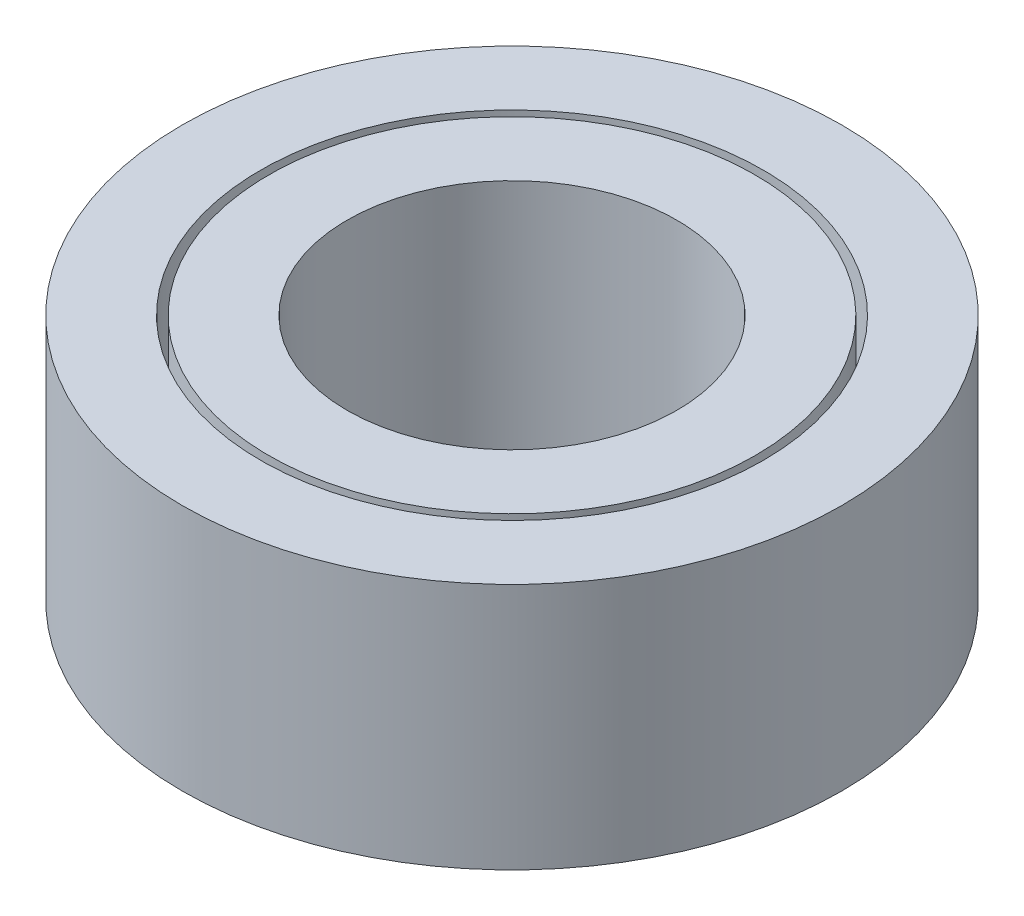
ISO-10303-21;
HEADER;
FILE_DESCRIPTION(('STEP AP214'),'2;1');
FILE_NAME('part.step','',(''),(''),'','','');
FILE_SCHEMA(('AUTOMOTIVE_DESIGN { 1 0 10303 214 1 1 1 1 }'));
ENDSEC;
DATA;
#1=APPLICATION_CONTEXT('core data for automotive mechanical design processes');
#2=APPLICATION_PROTOCOL_DEFINITION('international standard','automotive_design',2000,#1);
#3=PRODUCT_CONTEXT('',#1,'mechanical');
#4=PRODUCT('Part','Part','',(#3));
#5=PRODUCT_RELATED_PRODUCT_CATEGORY('part','',(#4));
#6=PRODUCT_DEFINITION_FORMATION('','',#4);
#7=PRODUCT_DEFINITION_CONTEXT('part definition',#1,'design');
#8=PRODUCT_DEFINITION('design','',#6,#7);
#9=PRODUCT_DEFINITION_SHAPE('','',#8);
#10=(LENGTH_UNIT() NAMED_UNIT(*) SI_UNIT(.MILLI.,.METRE.));
#11=(NAMED_UNIT(*) PLANE_ANGLE_UNIT() SI_UNIT($,.RADIAN.));
#12=(NAMED_UNIT(*) SI_UNIT($,.STERADIAN.) SOLID_ANGLE_UNIT());
#13=UNCERTAINTY_MEASURE_WITH_UNIT(LENGTH_MEASURE(1.E-05),#10,'distance_accuracy_value','');
#14=(GEOMETRIC_REPRESENTATION_CONTEXT(3) GLOBAL_UNCERTAINTY_ASSIGNED_CONTEXT((#13)) GLOBAL_UNIT_ASSIGNED_CONTEXT((#10,
#11,#12)) REPRESENTATION_CONTEXT('',''));
#15=CARTESIAN_POINT('',(0.,0.,0.));
#16=DIRECTION('',(0.,0.,1.));
#17=DIRECTION('',(1.,0.,0.));
#18=AXIS2_PLACEMENT_3D('',#15,#16,#17);
#19=CARTESIAN_POINT('',(0.,3.,0.));
#20=DIRECTION('',(0.,-1.,0.));
#21=DIRECTION('',(0.,0.,-1.));
#22=AXIS2_PLACEMENT_3D('',#19,#20,#21);
#23=CYLINDRICAL_SURFACE('',#22,4.);
#24=CARTESIAN_POINT('',(0.,3.,0.));
#25=DIRECTION('',(0.,1.,0.));
#26=DIRECTION('',(0.,0.,1.));
#27=AXIS2_PLACEMENT_3D('',#24,#25,#26);
#28=CIRCLE('',#27,4.);
#29=CARTESIAN_POINT('',(0.,3.,4.));
#30=VERTEX_POINT('',#29);
#31=EDGE_CURVE('E72',#30,#30,#28,.T.);
#32=ORIENTED_EDGE('',*,*,#31,.F.);
#33=EDGE_LOOP('',(#32));
#34=FACE_BOUND('',#33,.T.);
#35=CARTESIAN_POINT('',(0.,0.,0.));
#36=DIRECTION('',(0.,1.,0.));
#37=DIRECTION('',(0.,0.,1.));
#38=AXIS2_PLACEMENT_3D('',#35,#36,#37);
#39=CIRCLE('',#38,4.);
#40=CARTESIAN_POINT('',(0.,0.,4.));
#41=VERTEX_POINT('',#40);
#42=EDGE_CURVE('E77',#41,#41,#39,.T.);
#43=ORIENTED_EDGE('',*,*,#42,.T.);
#44=EDGE_LOOP('',(#43));
#45=FACE_BOUND('',#44,.T.);
#46=ADVANCED_FACE('F59',(#34,#45),#23,.T.);
#47=CARTESIAN_POINT('',(0.,3.,0.));
#48=DIRECTION('',(0.,1.,0.));
#49=DIRECTION('',(0.,0.,1.));
#50=AXIS2_PLACEMENT_3D('',#47,#48,#49);
#51=PLANE('',#50);
#52=CARTESIAN_POINT('',(0.,3.,0.));
#53=DIRECTION('',(0.,1.,0.));
#54=DIRECTION('',(1.,0.,0.));
#55=AXIS2_PLACEMENT_3D('',#52,#53,#54);
#56=CIRCLE('',#55,3.05);
#57=CARTESIAN_POINT('',(3.05,3.,0.));
#58=VERTEX_POINT('',#57);
#59=EDGE_CURVE('E12',#58,#58,#56,.T.);
#60=ORIENTED_EDGE('',*,*,#59,.F.);
#61=EDGE_LOOP('',(#60));
#62=FACE_BOUND('',#61,.T.);
#63=ORIENTED_EDGE('',*,*,#31,.T.);
#64=EDGE_LOOP('',(#63));
#65=FACE_BOUND('',#64,.T.);
#66=ADVANCED_FACE('F87',(#62,#65),#51,.T.);
#67=CARTESIAN_POINT('',(0.,0.,0.));
#68=DIRECTION('',(0.,1.,0.));
#69=DIRECTION('',(0.,0.,1.));
#70=AXIS2_PLACEMENT_3D('',#67,#68,#69);
#71=PLANE('',#70);
#72=CARTESIAN_POINT('',(0.,0.,0.));
#73=DIRECTION('',(0.,1.,0.));
#74=DIRECTION('',(1.,0.,0.));
#75=AXIS2_PLACEMENT_3D('',#72,#73,#74);
#76=CIRCLE('',#75,3.05);
#77=CARTESIAN_POINT('',(3.05,0.,0.));
#78=VERTEX_POINT('',#77);
#79=EDGE_CURVE('E67',#78,#78,#76,.T.);
#80=ORIENTED_EDGE('',*,*,#79,.T.);
#81=EDGE_LOOP('',(#80));
#82=FACE_BOUND('',#81,.T.);
#83=ORIENTED_EDGE('',*,*,#42,.F.);
#84=EDGE_LOOP('',(#83));
#85=FACE_BOUND('',#84,.T.);
#86=ADVANCED_FACE('F61',(#82,#85),#71,.F.);
#87=CARTESIAN_POINT('',(0.,3.,0.));
#88=DIRECTION('',(0.,-1.,0.));
#89=DIRECTION('',(0.,0.,-1.));
#90=AXIS2_PLACEMENT_3D('',#87,#88,#89);
#91=CYLINDRICAL_SURFACE('',#90,3.05);
#92=ORIENTED_EDGE('',*,*,#59,.T.);
#93=EDGE_LOOP('',(#92));
#94=FACE_BOUND('',#93,.T.);
#95=ORIENTED_EDGE('',*,*,#79,.F.);
#96=EDGE_LOOP('',(#95));
#97=FACE_BOUND('',#96,.T.);
#98=ADVANCED_FACE('F86',(#94,#97),#91,.F.);
#99=CLOSED_SHELL('',(#46,#66,#86,#98));
#100=MANIFOLD_SOLID_BREP('B2',#99);
#101=CARTESIAN_POINT('',(0.,3.,0.));
#102=DIRECTION('',(0.,1.,0.));
#103=DIRECTION('',(0.,0.,1.));
#104=AXIS2_PLACEMENT_3D('',#101,#102,#103);
#105=PLANE('',#104);
#106=CARTESIAN_POINT('',(0.,3.,0.));
#107=DIRECTION('',(0.,1.,0.));
#108=DIRECTION('',(0.,0.,1.));
#109=AXIS2_PLACEMENT_3D('',#106,#107,#108);
#110=CIRCLE('',#109,2.);
#111=CARTESIAN_POINT('',(0.,3.,2.));
#112=VERTEX_POINT('',#111);
#113=EDGE_CURVE('E58',#112,#112,#110,.T.);
#114=ORIENTED_EDGE('',*,*,#113,.F.);
#115=EDGE_LOOP('',(#114));
#116=FACE_BOUND('',#115,.T.);
#117=CARTESIAN_POINT('',(0.,3.,0.));
#118=DIRECTION('',(0.,1.,0.));
#119=DIRECTION('',(1.,0.,0.));
#120=AXIS2_PLACEMENT_3D('',#117,#118,#119);
#121=CIRCLE('',#120,2.95);
#122=CARTESIAN_POINT('',(2.95,3.,0.));
#123=VERTEX_POINT('',#122);
#124=EDGE_CURVE('E142',#123,#123,#121,.T.);
#125=ORIENTED_EDGE('',*,*,#124,.T.);
#126=EDGE_LOOP('',(#125));
#127=FACE_BOUND('',#126,.T.);
#128=ADVANCED_FACE('F131',(#116,#127),#105,.T.);
#129=CARTESIAN_POINT('',(0.,3.,0.));
#130=DIRECTION('',(0.,-1.,0.));
#131=DIRECTION('',(0.,0.,-1.));
#132=AXIS2_PLACEMENT_3D('',#129,#130,#131);
#133=CYLINDRICAL_SURFACE('',#132,2.);
#134=ORIENTED_EDGE('',*,*,#113,.T.);
#135=EDGE_LOOP('',(#134));
#136=FACE_BOUND('',#135,.T.);
#137=CARTESIAN_POINT('',(0.,0.,0.));
#138=DIRECTION('',(0.,1.,0.));
#139=DIRECTION('',(0.,0.,1.));
#140=AXIS2_PLACEMENT_3D('',#137,#138,#139);
#141=CIRCLE('',#140,2.);
#142=CARTESIAN_POINT('',(0.,0.,2.));
#143=VERTEX_POINT('',#142);
#144=EDGE_CURVE('E135',#143,#143,#141,.T.);
#145=ORIENTED_EDGE('',*,*,#144,.F.);
#146=EDGE_LOOP('',(#145));
#147=FACE_BOUND('',#146,.T.);
#148=ADVANCED_FACE('F158',(#136,#147),#133,.F.);
#149=CARTESIAN_POINT('',(0.,0.,0.));
#150=DIRECTION('',(0.,1.,0.));
#151=DIRECTION('',(0.,0.,1.));
#152=AXIS2_PLACEMENT_3D('',#149,#150,#151);
#153=PLANE('',#152);
#154=ORIENTED_EDGE('',*,*,#144,.T.);
#155=EDGE_LOOP('',(#154));
#156=FACE_BOUND('',#155,.T.);
#157=CARTESIAN_POINT('',(0.,0.,0.));
#158=DIRECTION('',(0.,1.,0.));
#159=DIRECTION('',(1.,0.,0.));
#160=AXIS2_PLACEMENT_3D('',#157,#158,#159);
#161=CIRCLE('',#160,2.95);
#162=CARTESIAN_POINT('',(2.95,0.,0.));
#163=VERTEX_POINT('',#162);
#164=EDGE_CURVE('E144',#163,#163,#161,.T.);
#165=ORIENTED_EDGE('',*,*,#164,.F.);
#166=EDGE_LOOP('',(#165));
#167=FACE_BOUND('',#166,.T.);
#168=ADVANCED_FACE('F133',(#156,#167),#153,.F.);
#169=CARTESIAN_POINT('',(0.,3.,0.));
#170=DIRECTION('',(0.,-1.,0.));
#171=DIRECTION('',(0.,0.,-1.));
#172=AXIS2_PLACEMENT_3D('',#169,#170,#171);
#173=CYLINDRICAL_SURFACE('',#172,2.95);
#174=ORIENTED_EDGE('',*,*,#124,.F.);
#175=EDGE_LOOP('',(#174));
#176=FACE_BOUND('',#175,.T.);
#177=ORIENTED_EDGE('',*,*,#164,.T.);
#178=EDGE_LOOP('',(#177));
#179=FACE_BOUND('',#178,.T.);
#180=ADVANCED_FACE('F151',(#176,#179),#173,.T.);
#181=CLOSED_SHELL('',(#128,#148,#168,#180));
#182=MANIFOLD_SOLID_BREP('B7',#181);
#183=ADVANCED_BREP_SHAPE_REPRESENTATION('',(#18,#100,#182),#14);
#184=SHAPE_DEFINITION_REPRESENTATION(#9,#183);
ENDSEC;
END-ISO-10303-21;
